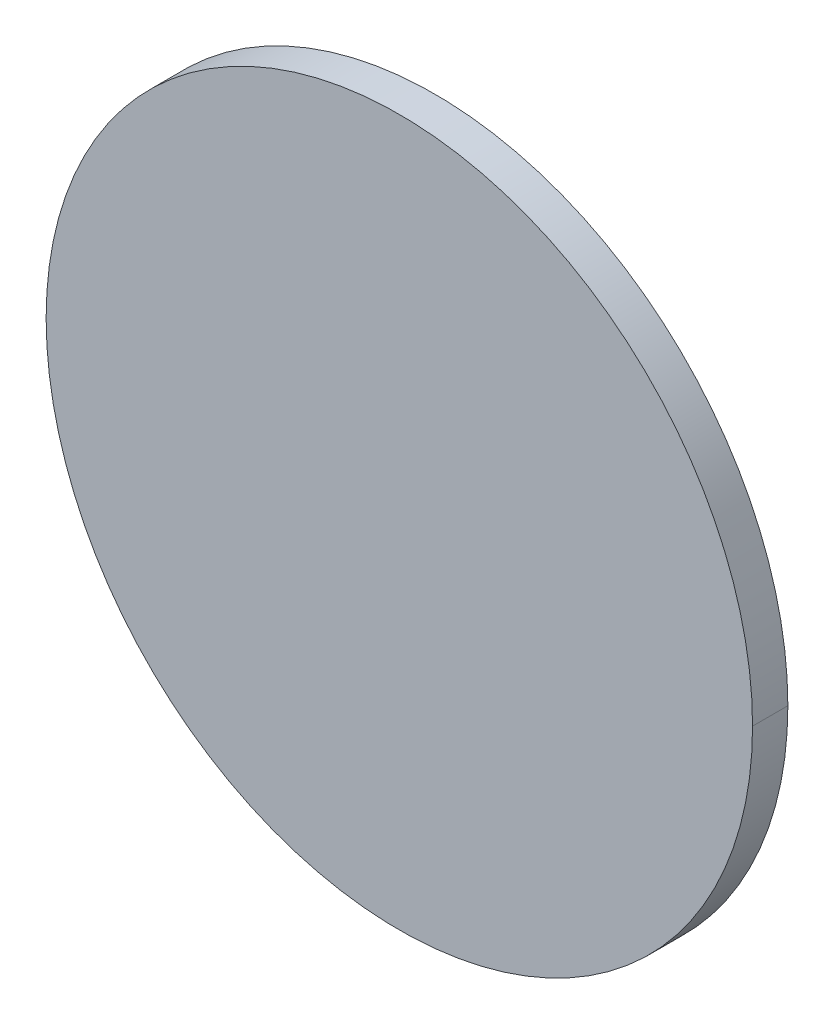
ISO-10303-21;
HEADER;
FILE_DESCRIPTION(('STEP AP214'),'2;1');
FILE_NAME('part.step','',(''),(''),'','','');
FILE_SCHEMA(('AUTOMOTIVE_DESIGN { 1 0 10303 214 1 1 1 1 }'));
ENDSEC;
DATA;
#1=APPLICATION_CONTEXT('core data for automotive mechanical design processes');
#2=APPLICATION_PROTOCOL_DEFINITION('international standard','automotive_design',2000,#1);
#3=PRODUCT_CONTEXT('',#1,'mechanical');
#4=PRODUCT('Part','Part','',(#3));
#5=PRODUCT_RELATED_PRODUCT_CATEGORY('part','',(#4));
#6=PRODUCT_DEFINITION_FORMATION('','',#4);
#7=PRODUCT_DEFINITION_CONTEXT('part definition',#1,'design');
#8=PRODUCT_DEFINITION('design','',#6,#7);
#9=PRODUCT_DEFINITION_SHAPE('','',#8);
#10=(LENGTH_UNIT() NAMED_UNIT(*) SI_UNIT(.MILLI.,.METRE.));
#11=(NAMED_UNIT(*) PLANE_ANGLE_UNIT() SI_UNIT($,.RADIAN.));
#12=(NAMED_UNIT(*) SI_UNIT($,.STERADIAN.) SOLID_ANGLE_UNIT());
#13=UNCERTAINTY_MEASURE_WITH_UNIT(LENGTH_MEASURE(1.E-05),#10,'distance_accuracy_value','');
#14=(GEOMETRIC_REPRESENTATION_CONTEXT(3) GLOBAL_UNCERTAINTY_ASSIGNED_CONTEXT((#13)) GLOBAL_UNIT_ASSIGNED_CONTEXT((#10,
#11,#12)) REPRESENTATION_CONTEXT('',''));
#15=CARTESIAN_POINT('',(0.,0.,0.));
#16=DIRECTION('',(0.,0.,1.));
#17=DIRECTION('',(1.,0.,0.));
#18=AXIS2_PLACEMENT_3D('',#15,#16,#17);
#19=CARTESIAN_POINT('',(-0.193989690447714,0.112000000000001,-0.0028));
#20=DIRECTION('',(0.,0.,1.));
#21=DIRECTION('',(1.,0.,0.));
#22=AXIS2_PLACEMENT_3D('',#19,#20,#21);
#23=CYLINDRICAL_SURFACE('',#22,0.056);
#24=CARTESIAN_POINT('',(-0.193989690447714,0.112000000000001,-0.0028));
#25=DIRECTION('',(0.,0.,1.));
#26=DIRECTION('',(1.,0.,0.));
#27=AXIS2_PLACEMENT_3D('',#24,#25,#26);
#28=CIRCLE('',#27,0.056);
#29=CARTESIAN_POINT('',(-0.137989690447714,0.112000000000001,-0.0028));
#30=VERTEX_POINT('',#29);
#31=CARTESIAN_POINT('',(-0.249989690447714,0.112000000000001,-0.0028));
#32=VERTEX_POINT('',#31);
#33=EDGE_CURVE('E11',#30,#32,#28,.T.);
#34=ORIENTED_EDGE('',*,*,#33,.T.);
#35=DIRECTION('',(0.,0.,1.));
#36=VECTOR('',#35,1.);
#37=CARTESIAN_POINT('',(-0.249989690447714,0.112000000000001,-0.0028));
#38=LINE('',#37,#36);
#39=CARTESIAN_POINT('',(-0.249989690447714,0.112000000000001,0.0028));
#40=VERTEX_POINT('',#39);
#41=EDGE_CURVE('E24',#32,#40,#38,.T.);
#42=ORIENTED_EDGE('',*,*,#41,.T.);
#43=CARTESIAN_POINT('',(-0.193989690447714,0.112000000000001,0.0028));
#44=DIRECTION('',(0.,0.,1.));
#45=DIRECTION('',(1.,0.,0.));
#46=AXIS2_PLACEMENT_3D('',#43,#44,#45);
#47=CIRCLE('',#46,0.056);
#48=CARTESIAN_POINT('',(-0.137989690447714,0.112000000000001,0.0028));
#49=VERTEX_POINT('',#48);
#50=EDGE_CURVE('E39',#49,#40,#47,.T.);
#51=ORIENTED_EDGE('',*,*,#50,.F.);
#52=DIRECTION('',(0.,0.,1.));
#53=VECTOR('',#52,1.);
#54=CARTESIAN_POINT('',(-0.137989690447714,0.112000000000001,-0.0028));
#55=LINE('',#54,#53);
#56=EDGE_CURVE('E41',#30,#49,#55,.T.);
#57=ORIENTED_EDGE('',*,*,#56,.F.);
#58=EDGE_LOOP('',(#34,#42,#51,#57));
#59=FACE_BOUND('',#58,.T.);
#60=ADVANCED_FACE('F17',(#59),#23,.T.);
#61=CARTESIAN_POINT('',(-0.193989690447714,0.112000000000001,-0.0028));
#62=DIRECTION('',(0.,0.,1.));
#63=DIRECTION('',(1.,0.,0.));
#64=AXIS2_PLACEMENT_3D('',#61,#62,#63);
#65=CYLINDRICAL_SURFACE('',#64,0.056);
#66=ORIENTED_EDGE('',*,*,#41,.F.);
#67=CARTESIAN_POINT('',(-0.193989690447714,0.112000000000001,-0.0028));
#68=DIRECTION('',(0.,0.,1.));
#69=DIRECTION('',(1.,0.,0.));
#70=AXIS2_PLACEMENT_3D('',#67,#68,#69);
#71=CIRCLE('',#70,0.056);
#72=EDGE_CURVE('E50',#32,#30,#71,.T.);
#73=ORIENTED_EDGE('',*,*,#72,.T.);
#74=ORIENTED_EDGE('',*,*,#56,.T.);
#75=CARTESIAN_POINT('',(-0.193989690447714,0.112000000000001,0.0028));
#76=DIRECTION('',(0.,0.,1.));
#77=DIRECTION('',(1.,0.,0.));
#78=AXIS2_PLACEMENT_3D('',#75,#76,#77);
#79=CIRCLE('',#78,0.056);
#80=EDGE_CURVE('E49',#40,#49,#79,.T.);
#81=ORIENTED_EDGE('',*,*,#80,.F.);
#82=EDGE_LOOP('',(#66,#73,#74,#81));
#83=FACE_BOUND('',#82,.T.);
#84=ADVANCED_FACE('F48',(#83),#65,.T.);
#85=CARTESIAN_POINT('',(0.,0.,-0.0028));
#86=DIRECTION('',(0.,0.,1.));
#87=DIRECTION('',(1.,0.,0.));
#88=AXIS2_PLACEMENT_3D('',#85,#86,#87);
#89=PLANE('',#88);
#90=ORIENTED_EDGE('',*,*,#33,.F.);
#91=ORIENTED_EDGE('',*,*,#72,.F.);
#92=EDGE_LOOP('',(#90,#91));
#93=FACE_BOUND('',#92,.T.);
#94=ADVANCED_FACE('F56',(#93),#89,.F.);
#95=CARTESIAN_POINT('',(0.,0.,0.0028));
#96=DIRECTION('',(0.,0.,1.));
#97=DIRECTION('',(1.,0.,0.));
#98=AXIS2_PLACEMENT_3D('',#95,#96,#97);
#99=PLANE('',#98);
#100=ORIENTED_EDGE('',*,*,#50,.T.);
#101=ORIENTED_EDGE('',*,*,#80,.T.);
#102=EDGE_LOOP('',(#100,#101));
#103=FACE_BOUND('',#102,.T.);
#104=ADVANCED_FACE('F52',(#103),#99,.T.);
#105=CLOSED_SHELL('',(#60,#84,#94,#104));
#106=MANIFOLD_SOLID_BREP('B1',#105);
#107=ADVANCED_BREP_SHAPE_REPRESENTATION('',(#18,#106),#14);
#108=SHAPE_DEFINITION_REPRESENTATION(#9,#107);
ENDSEC;
END-ISO-10303-21;
